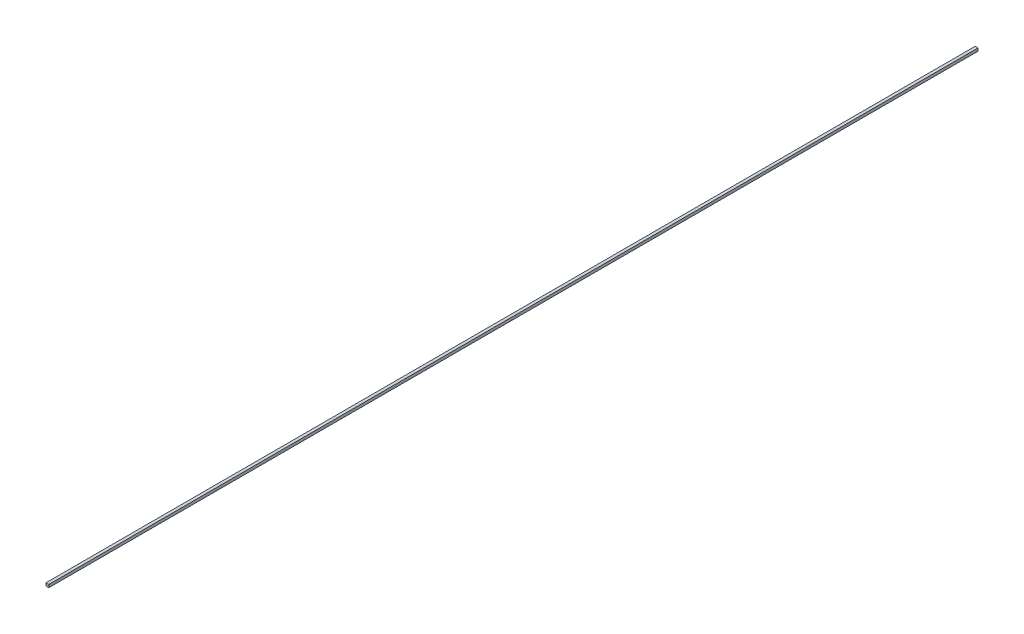
ISO-10303-21;
HEADER;
FILE_DESCRIPTION(('STEP AP214'),'2;1');
FILE_NAME('part.step','',(''),(''),'','','');
FILE_SCHEMA(('AUTOMOTIVE_DESIGN { 1 0 10303 214 1 1 1 1 }'));
ENDSEC;
DATA;
#1=APPLICATION_CONTEXT('core data for automotive mechanical design processes');
#2=APPLICATION_PROTOCOL_DEFINITION('international standard','automotive_design',2000,#1);
#3=PRODUCT_CONTEXT('',#1,'mechanical');
#4=PRODUCT('Part','Part','',(#3));
#5=PRODUCT_RELATED_PRODUCT_CATEGORY('part','',(#4));
#6=PRODUCT_DEFINITION_FORMATION('','',#4);
#7=PRODUCT_DEFINITION_CONTEXT('part definition',#1,'design');
#8=PRODUCT_DEFINITION('design','',#6,#7);
#9=PRODUCT_DEFINITION_SHAPE('','',#8);
#10=(LENGTH_UNIT() NAMED_UNIT(*) SI_UNIT(.MILLI.,.METRE.));
#11=(NAMED_UNIT(*) PLANE_ANGLE_UNIT() SI_UNIT($,.RADIAN.));
#12=(NAMED_UNIT(*) SI_UNIT($,.STERADIAN.) SOLID_ANGLE_UNIT());
#13=UNCERTAINTY_MEASURE_WITH_UNIT(LENGTH_MEASURE(1.E-05),#10,'distance_accuracy_value','');
#14=(GEOMETRIC_REPRESENTATION_CONTEXT(3) GLOBAL_UNCERTAINTY_ASSIGNED_CONTEXT((#13)) GLOBAL_UNIT_ASSIGNED_CONTEXT((#10,
#11,#12)) REPRESENTATION_CONTEXT('',''));
#15=CARTESIAN_POINT('',(0.,0.,0.));
#16=DIRECTION('',(0.,0.,1.));
#17=DIRECTION('',(1.,0.,0.));
#18=AXIS2_PLACEMENT_3D('',#15,#16,#17);
#19=CARTESIAN_POINT('',(0.,0.,651.5));
#20=DIRECTION('',(1.,0.,0.));
#21=DIRECTION('',(0.,0.,-1.));
#22=AXIS2_PLACEMENT_3D('',#19,#20,#21);
#23=PLANE('',#22);
#24=DIRECTION('',(0.,-1.,0.));
#25=VECTOR('',#24,1.);
#26=CARTESIAN_POINT('',(0.,0.,0.));
#27=LINE('',#26,#25);
#28=CARTESIAN_POINT('',(0.,2.,0.));
#29=VERTEX_POINT('',#28);
#30=CARTESIAN_POINT('',(0.,0.,0.));
#31=VERTEX_POINT('',#30);
#32=EDGE_CURVE('E101',#29,#31,#27,.T.);
#33=ORIENTED_EDGE('',*,*,#32,.T.);
#34=DIRECTION('',(0.,0.,-1.));
#35=VECTOR('',#34,1.);
#36=CARTESIAN_POINT('',(0.,0.,651.5));
#37=LINE('',#36,#35);
#38=CARTESIAN_POINT('',(0.,0.,651.5));
#39=VERTEX_POINT('',#38);
#40=EDGE_CURVE('E11',#39,#31,#37,.T.);
#41=ORIENTED_EDGE('',*,*,#40,.F.);
#42=DIRECTION('',(0.,-1.,0.));
#43=VECTOR('',#42,1.);
#44=CARTESIAN_POINT('',(0.,0.,651.5));
#45=LINE('',#44,#43);
#46=CARTESIAN_POINT('',(0.,2.,651.5));
#47=VERTEX_POINT('',#46);
#48=EDGE_CURVE('E89',#47,#39,#45,.T.);
#49=ORIENTED_EDGE('',*,*,#48,.F.);
#50=DIRECTION('',(0.,0.,-1.));
#51=VECTOR('',#50,1.);
#52=CARTESIAN_POINT('',(0.,2.,651.5));
#53=LINE('',#52,#51);
#54=EDGE_CURVE('E97',#47,#29,#53,.T.);
#55=ORIENTED_EDGE('',*,*,#54,.T.);
#56=EDGE_LOOP('',(#33,#41,#49,#55));
#57=FACE_BOUND('',#56,.T.);
#58=ADVANCED_FACE('F38',(#57),#23,.F.);
#59=CARTESIAN_POINT('',(0.,0.,651.5));
#60=DIRECTION('',(0.,1.,0.));
#61=DIRECTION('',(0.,0.,1.));
#62=AXIS2_PLACEMENT_3D('',#59,#60,#61);
#63=PLANE('',#62);
#64=DIRECTION('',(1.,0.,0.));
#65=VECTOR('',#64,1.);
#66=CARTESIAN_POINT('',(0.,0.,0.));
#67=LINE('',#66,#65);
#68=CARTESIAN_POINT('',(2.,0.,0.));
#69=VERTEX_POINT('',#68);
#70=EDGE_CURVE('E93',#31,#69,#67,.T.);
#71=ORIENTED_EDGE('',*,*,#70,.T.);
#72=DIRECTION('',(0.,0.,-1.));
#73=VECTOR('',#72,1.);
#74=CARTESIAN_POINT('',(2.,0.,651.5));
#75=LINE('',#74,#73);
#76=CARTESIAN_POINT('',(2.,0.,651.5));
#77=VERTEX_POINT('',#76);
#78=EDGE_CURVE('E46',#77,#69,#75,.T.);
#79=ORIENTED_EDGE('',*,*,#78,.F.);
#80=DIRECTION('',(1.,0.,0.));
#81=VECTOR('',#80,1.);
#82=CARTESIAN_POINT('',(0.,0.,651.5));
#83=LINE('',#82,#81);
#84=EDGE_CURVE('E84',#39,#77,#83,.T.);
#85=ORIENTED_EDGE('',*,*,#84,.F.);
#86=ORIENTED_EDGE('',*,*,#40,.T.);
#87=EDGE_LOOP('',(#71,#79,#85,#86));
#88=FACE_BOUND('',#87,.T.);
#89=ADVANCED_FACE('F92',(#88),#63,.F.);
#90=CARTESIAN_POINT('',(2.,0.,651.5));
#91=DIRECTION('',(-1.,0.,0.));
#92=DIRECTION('',(0.,-1.,0.));
#93=AXIS2_PLACEMENT_3D('',#90,#91,#92);
#94=PLANE('',#93);
#95=DIRECTION('',(0.,1.,0.));
#96=VECTOR('',#95,1.);
#97=CARTESIAN_POINT('',(2.,0.,0.));
#98=LINE('',#97,#96);
#99=CARTESIAN_POINT('',(2.,2.,0.));
#100=VERTEX_POINT('',#99);
#101=EDGE_CURVE('E71',#69,#100,#98,.T.);
#102=ORIENTED_EDGE('',*,*,#101,.T.);
#103=DIRECTION('',(0.,0.,-1.));
#104=VECTOR('',#103,1.);
#105=CARTESIAN_POINT('',(2.,2.,651.5));
#106=LINE('',#105,#104);
#107=CARTESIAN_POINT('',(2.,2.,651.5));
#108=VERTEX_POINT('',#107);
#109=EDGE_CURVE('E94',#108,#100,#106,.T.);
#110=ORIENTED_EDGE('',*,*,#109,.F.);
#111=DIRECTION('',(0.,1.,0.));
#112=VECTOR('',#111,1.);
#113=CARTESIAN_POINT('',(2.,0.,651.5));
#114=LINE('',#113,#112);
#115=EDGE_CURVE('E87',#77,#108,#114,.T.);
#116=ORIENTED_EDGE('',*,*,#115,.F.);
#117=ORIENTED_EDGE('',*,*,#78,.T.);
#118=EDGE_LOOP('',(#102,#110,#116,#117));
#119=FACE_BOUND('',#118,.T.);
#120=ADVANCED_FACE('F95',(#119),#94,.F.);
#121=CARTESIAN_POINT('',(0.,2.,651.5));
#122=DIRECTION('',(0.,-1.,0.));
#123=DIRECTION('',(0.,0.,-1.));
#124=AXIS2_PLACEMENT_3D('',#121,#122,#123);
#125=PLANE('',#124);
#126=DIRECTION('',(-1.,0.,0.));
#127=VECTOR('',#126,1.);
#128=CARTESIAN_POINT('',(0.,2.,0.));
#129=LINE('',#128,#127);
#130=EDGE_CURVE('E77',#100,#29,#129,.T.);
#131=ORIENTED_EDGE('',*,*,#130,.T.);
#132=ORIENTED_EDGE('',*,*,#54,.F.);
#133=DIRECTION('',(-1.,0.,0.));
#134=VECTOR('',#133,1.);
#135=CARTESIAN_POINT('',(0.,2.,651.5));
#136=LINE('',#135,#134);
#137=EDGE_CURVE('E54',#108,#47,#136,.T.);
#138=ORIENTED_EDGE('',*,*,#137,.F.);
#139=ORIENTED_EDGE('',*,*,#109,.T.);
#140=EDGE_LOOP('',(#131,#132,#138,#139));
#141=FACE_BOUND('',#140,.T.);
#142=ADVANCED_FACE('F108',(#141),#125,.F.);
#143=CARTESIAN_POINT('',(0.,0.,651.5));
#144=DIRECTION('',(0.,0.,-1.));
#145=DIRECTION('',(-1.,0.,0.));
#146=AXIS2_PLACEMENT_3D('',#143,#144,#145);
#147=PLANE('',#146);
#148=ORIENTED_EDGE('',*,*,#48,.T.);
#149=ORIENTED_EDGE('',*,*,#84,.T.);
#150=ORIENTED_EDGE('',*,*,#115,.T.);
#151=ORIENTED_EDGE('',*,*,#137,.T.);
#152=EDGE_LOOP('',(#148,#149,#150,#151));
#153=FACE_BOUND('',#152,.T.);
#154=ADVANCED_FACE('F85',(#153),#147,.F.);
#155=CARTESIAN_POINT('',(0.,0.,0.));
#156=DIRECTION('',(0.,0.,-1.));
#157=DIRECTION('',(-1.,0.,0.));
#158=AXIS2_PLACEMENT_3D('',#155,#156,#157);
#159=PLANE('',#158);
#160=ORIENTED_EDGE('',*,*,#32,.F.);
#161=ORIENTED_EDGE('',*,*,#130,.F.);
#162=ORIENTED_EDGE('',*,*,#101,.F.);
#163=ORIENTED_EDGE('',*,*,#70,.F.);
#164=EDGE_LOOP('',(#160,#161,#162,#163));
#165=FACE_BOUND('',#164,.T.);
#166=ADVANCED_FACE('F111',(#165),#159,.T.);
#167=CLOSED_SHELL('',(#58,#89,#120,#142,#154,#166));
#168=MANIFOLD_SOLID_BREP('B2',#167);
#169=ADVANCED_BREP_SHAPE_REPRESENTATION('',(#18,#168),#14);
#170=SHAPE_DEFINITION_REPRESENTATION(#9,#169);
ENDSEC;
END-ISO-10303-21;
